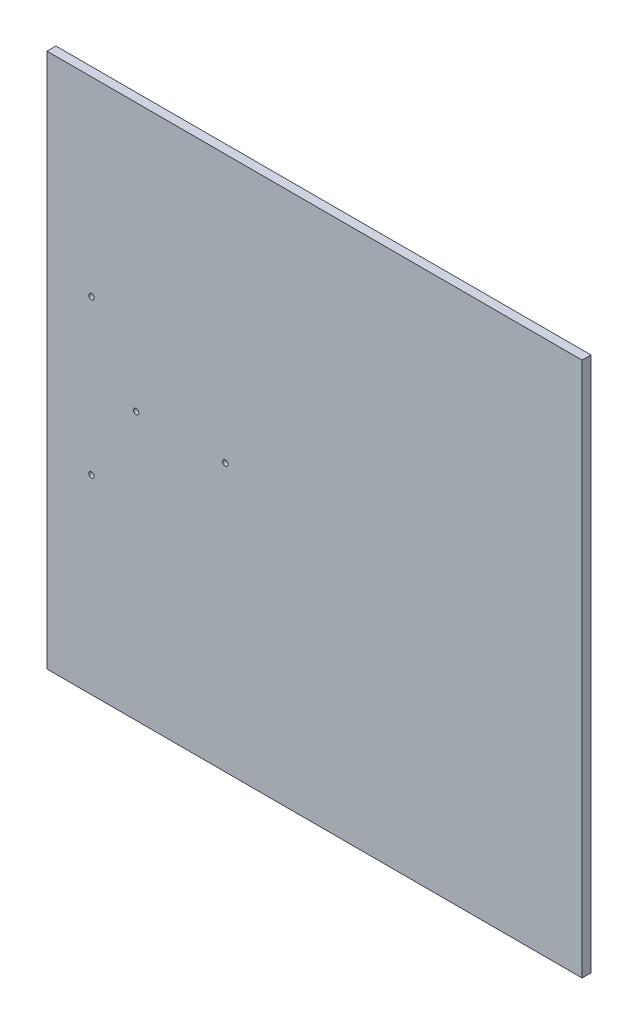
ISO-10303-21;
HEADER;
FILE_DESCRIPTION(('STEP AP214'),'2;1');
FILE_NAME('part.step','',(''),(''),'','','');
FILE_SCHEMA(('AUTOMOTIVE_DESIGN { 1 0 10303 214 1 1 1 1 }'));
ENDSEC;
DATA;
#1=APPLICATION_CONTEXT('core data for automotive mechanical design processes');
#2=APPLICATION_PROTOCOL_DEFINITION('international standard','automotive_design',2000,#1);
#3=PRODUCT_CONTEXT('',#1,'mechanical');
#4=PRODUCT('Part','Part','',(#3));
#5=PRODUCT_RELATED_PRODUCT_CATEGORY('part','',(#4));
#6=PRODUCT_DEFINITION_FORMATION('','',#4);
#7=PRODUCT_DEFINITION_CONTEXT('part definition',#1,'design');
#8=PRODUCT_DEFINITION('design','',#6,#7);
#9=PRODUCT_DEFINITION_SHAPE('','',#8);
#10=(LENGTH_UNIT() NAMED_UNIT(*) SI_UNIT(.MILLI.,.METRE.));
#11=(NAMED_UNIT(*) PLANE_ANGLE_UNIT() SI_UNIT($,.RADIAN.));
#12=(NAMED_UNIT(*) SI_UNIT($,.STERADIAN.) SOLID_ANGLE_UNIT());
#13=UNCERTAINTY_MEASURE_WITH_UNIT(LENGTH_MEASURE(1.E-05),#10,'distance_accuracy_value','');
#14=(GEOMETRIC_REPRESENTATION_CONTEXT(3) GLOBAL_UNCERTAINTY_ASSIGNED_CONTEXT((#13)) GLOBAL_UNIT_ASSIGNED_CONTEXT((#10,
#11,#12)) REPRESENTATION_CONTEXT('',''));
#15=CARTESIAN_POINT('',(0.,0.,0.));
#16=DIRECTION('',(0.,0.,1.));
#17=DIRECTION('',(1.,0.,0.));
#18=AXIS2_PLACEMENT_3D('',#15,#16,#17);
#19=CARTESIAN_POINT('',(-149.112426035503,66.5680473372781,5.));
#20=DIRECTION('',(1.,0.,0.));
#21=DIRECTION('',(0.,0.,-1.));
#22=AXIS2_PLACEMENT_3D('',#19,#20,#21);
#23=PLANE('',#22);
#24=DIRECTION('',(0.,-1.,0.));
#25=VECTOR('',#24,1.);
#26=CARTESIAN_POINT('',(-149.112426035503,66.5680473372781,0.));
#27=LINE('',#26,#25);
#28=CARTESIAN_POINT('',(-149.112426035503,66.5680473372781,0.));
#29=VERTEX_POINT('',#28);
#30=CARTESIAN_POINT('',(-149.112426035503,-233.431952662722,0.));
#31=VERTEX_POINT('',#30);
#32=EDGE_CURVE('E109',#29,#31,#27,.T.);
#33=ORIENTED_EDGE('',*,*,#32,.T.);
#34=DIRECTION('',(0.,0.,-1.));
#35=VECTOR('',#34,1.);
#36=CARTESIAN_POINT('',(-149.112426035503,-233.431952662722,5.));
#37=LINE('',#36,#35);
#38=CARTESIAN_POINT('',(-149.112426035503,-233.431952662722,5.));
#39=VERTEX_POINT('',#38);
#40=EDGE_CURVE('E11',#39,#31,#37,.T.);
#41=ORIENTED_EDGE('',*,*,#40,.F.);
#42=DIRECTION('',(0.,-1.,0.));
#43=VECTOR('',#42,1.);
#44=CARTESIAN_POINT('',(-149.112426035503,66.5680473372781,5.));
#45=LINE('',#44,#43);
#46=CARTESIAN_POINT('',(-149.112426035503,66.5680473372781,5.));
#47=VERTEX_POINT('',#46);
#48=EDGE_CURVE('E93',#47,#39,#45,.T.);
#49=ORIENTED_EDGE('',*,*,#48,.F.);
#50=DIRECTION('',(0.,0.,-1.));
#51=VECTOR('',#50,1.);
#52=CARTESIAN_POINT('',(-149.112426035503,66.5680473372781,5.));
#53=LINE('',#52,#51);
#54=EDGE_CURVE('E105',#47,#29,#53,.T.);
#55=ORIENTED_EDGE('',*,*,#54,.T.);
#56=EDGE_LOOP('',(#33,#41,#49,#55));
#57=FACE_BOUND('',#56,.T.);
#58=ADVANCED_FACE('F41',(#57),#23,.F.);
#59=CARTESIAN_POINT('',(-149.112426035503,-233.431952662722,5.));
#60=DIRECTION('',(0.,1.,0.));
#61=DIRECTION('',(0.,0.,1.));
#62=AXIS2_PLACEMENT_3D('',#59,#60,#61);
#63=PLANE('',#62);
#64=DIRECTION('',(1.,0.,0.));
#65=VECTOR('',#64,1.);
#66=CARTESIAN_POINT('',(-149.112426035503,-233.431952662722,0.));
#67=LINE('',#66,#65);
#68=CARTESIAN_POINT('',(150.887573964497,-233.431952662722,0.));
#69=VERTEX_POINT('',#68);
#70=EDGE_CURVE('E98',#31,#69,#67,.T.);
#71=ORIENTED_EDGE('',*,*,#70,.T.);
#72=DIRECTION('',(0.,0.,-1.));
#73=VECTOR('',#72,1.);
#74=CARTESIAN_POINT('',(150.887573964497,-233.431952662722,5.));
#75=LINE('',#74,#73);
#76=CARTESIAN_POINT('',(150.887573964497,-233.431952662722,5.));
#77=VERTEX_POINT('',#76);
#78=EDGE_CURVE('E50',#77,#69,#75,.T.);
#79=ORIENTED_EDGE('',*,*,#78,.F.);
#80=DIRECTION('',(1.,0.,0.));
#81=VECTOR('',#80,1.);
#82=CARTESIAN_POINT('',(-149.112426035503,-233.431952662722,5.));
#83=LINE('',#82,#81);
#84=EDGE_CURVE('E88',#39,#77,#83,.T.);
#85=ORIENTED_EDGE('',*,*,#84,.F.);
#86=ORIENTED_EDGE('',*,*,#40,.T.);
#87=EDGE_LOOP('',(#71,#79,#85,#86));
#88=FACE_BOUND('',#87,.T.);
#89=ADVANCED_FACE('F97',(#88),#63,.F.);
#90=CARTESIAN_POINT('',(150.887573964497,66.5680473372781,5.));
#91=DIRECTION('',(-1.,0.,0.));
#92=DIRECTION('',(0.,-1.,0.));
#93=AXIS2_PLACEMENT_3D('',#90,#91,#92);
#94=PLANE('',#93);
#95=DIRECTION('',(0.,1.,0.));
#96=VECTOR('',#95,1.);
#97=CARTESIAN_POINT('',(150.887573964497,66.5680473372781,0.));
#98=LINE('',#97,#96);
#99=CARTESIAN_POINT('',(150.887573964497,66.5680473372781,0.));
#100=VERTEX_POINT('',#99);
#101=EDGE_CURVE('E75',#69,#100,#98,.T.);
#102=ORIENTED_EDGE('',*,*,#101,.T.);
#103=DIRECTION('',(0.,0.,-1.));
#104=VECTOR('',#103,1.);
#105=CARTESIAN_POINT('',(150.887573964497,66.5680473372781,5.));
#106=LINE('',#105,#104);
#107=CARTESIAN_POINT('',(150.887573964497,66.5680473372781,5.));
#108=VERTEX_POINT('',#107);
#109=EDGE_CURVE('E100',#108,#100,#106,.T.);
#110=ORIENTED_EDGE('',*,*,#109,.F.);
#111=DIRECTION('',(0.,1.,0.));
#112=VECTOR('',#111,1.);
#113=CARTESIAN_POINT('',(150.887573964497,66.5680473372781,5.));
#114=LINE('',#113,#112);
#115=EDGE_CURVE('E91',#77,#108,#114,.T.);
#116=ORIENTED_EDGE('',*,*,#115,.F.);
#117=ORIENTED_EDGE('',*,*,#78,.T.);
#118=EDGE_LOOP('',(#102,#110,#116,#117));
#119=FACE_BOUND('',#118,.T.);
#120=ADVANCED_FACE('F101',(#119),#94,.F.);
#121=CARTESIAN_POINT('',(-149.112426035503,66.5680473372781,5.));
#122=DIRECTION('',(0.,-1.,0.));
#123=DIRECTION('',(0.,0.,-1.));
#124=AXIS2_PLACEMENT_3D('',#121,#122,#123);
#125=PLANE('',#124);
#126=DIRECTION('',(-1.,0.,0.));
#127=VECTOR('',#126,1.);
#128=CARTESIAN_POINT('',(-149.112426035503,66.5680473372781,0.));
#129=LINE('',#128,#127);
#130=EDGE_CURVE('E81',#100,#29,#129,.T.);
#131=ORIENTED_EDGE('',*,*,#130,.T.);
#132=ORIENTED_EDGE('',*,*,#54,.F.);
#133=DIRECTION('',(-1.,0.,0.));
#134=VECTOR('',#133,1.);
#135=CARTESIAN_POINT('',(-149.112426035503,66.5680473372781,5.));
#136=LINE('',#135,#134);
#137=EDGE_CURVE('E58',#108,#47,#136,.T.);
#138=ORIENTED_EDGE('',*,*,#137,.F.);
#139=ORIENTED_EDGE('',*,*,#109,.T.);
#140=EDGE_LOOP('',(#131,#132,#138,#139));
#141=FACE_BOUND('',#140,.T.);
#142=ADVANCED_FACE('F123',(#141),#125,.F.);
#143=CARTESIAN_POINT('',(0.,0.,5.));
#144=DIRECTION('',(0.,0.,1.));
#145=DIRECTION('',(1.,0.,0.));
#146=AXIS2_PLACEMENT_3D('',#143,#144,#145);
#147=PLANE('',#146);
#148=CARTESIAN_POINT('',(-49.112426035503,-83.4319526627219,5.));
#149=DIRECTION('',(0.,0.,1.));
#150=DIRECTION('',(1.,0.,0.));
#151=AXIS2_PLACEMENT_3D('',#148,#149,#150);
#152=CIRCLE('',#151,1.5);
#153=CARTESIAN_POINT('',(-47.612426035503,-83.4319526627219,5.));
#154=VERTEX_POINT('',#153);
#155=EDGE_CURVE('E154',#154,#154,#152,.T.);
#156=ORIENTED_EDGE('',*,*,#155,.F.);
#157=EDGE_LOOP('',(#156));
#158=FACE_BOUND('',#157,.T.);
#159=CARTESIAN_POINT('',(-124.112426035503,-40.1306824735001,5.));
#160=DIRECTION('',(0.,0.,1.));
#161=DIRECTION('',(1.,0.,0.));
#162=AXIS2_PLACEMENT_3D('',#159,#160,#161);
#163=CIRCLE('',#162,1.5);
#164=CARTESIAN_POINT('',(-122.612426035503,-40.1306824735001,5.));
#165=VERTEX_POINT('',#164);
#166=EDGE_CURVE('E146',#165,#165,#163,.T.);
#167=ORIENTED_EDGE('',*,*,#166,.F.);
#168=EDGE_LOOP('',(#167));
#169=FACE_BOUND('',#168,.T.);
#170=CARTESIAN_POINT('',(-124.112426035503,-126.733222851944,5.));
#171=DIRECTION('',(0.,0.,1.));
#172=DIRECTION('',(-1.,0.,0.));
#173=AXIS2_PLACEMENT_3D('',#170,#171,#172);
#174=CIRCLE('',#173,1.5);
#175=CARTESIAN_POINT('',(-125.612426035503,-126.733222851944,5.));
#176=VERTEX_POINT('',#175);
#177=EDGE_CURVE('E138',#176,#176,#174,.T.);
#178=ORIENTED_EDGE('',*,*,#177,.F.);
#179=EDGE_LOOP('',(#178));
#180=FACE_BOUND('',#179,.T.);
#181=CARTESIAN_POINT('',(-99.112426035503,-83.4319526627219,5.));
#182=DIRECTION('',(0.,0.,1.));
#183=DIRECTION('',(1.,0.,0.));
#184=AXIS2_PLACEMENT_3D('',#181,#182,#183);
#185=CIRCLE('',#184,1.5);
#186=CARTESIAN_POINT('',(-97.612426035503,-83.4319526627219,5.));
#187=VERTEX_POINT('',#186);
#188=EDGE_CURVE('E130',#187,#187,#185,.T.);
#189=ORIENTED_EDGE('',*,*,#188,.F.);
#190=EDGE_LOOP('',(#189));
#191=FACE_BOUND('',#190,.T.);
#192=ORIENTED_EDGE('',*,*,#48,.T.);
#193=ORIENTED_EDGE('',*,*,#84,.T.);
#194=ORIENTED_EDGE('',*,*,#115,.T.);
#195=ORIENTED_EDGE('',*,*,#137,.T.);
#196=EDGE_LOOP('',(#192,#193,#194,#195));
#197=FACE_BOUND('',#196,.T.);
#198=ADVANCED_FACE('F89',(#158,#169,#180,#191,#197),#147,.T.);
#199=CARTESIAN_POINT('',(0.,0.,0.));
#200=DIRECTION('',(0.,0.,1.));
#201=DIRECTION('',(1.,0.,0.));
#202=AXIS2_PLACEMENT_3D('',#199,#200,#201);
#203=PLANE('',#202);
#204=CARTESIAN_POINT('',(-49.112426035503,-83.4319526627219,0.));
#205=DIRECTION('',(0.,0.,1.));
#206=DIRECTION('',(1.,0.,0.));
#207=AXIS2_PLACEMENT_3D('',#204,#205,#206);
#208=CIRCLE('',#207,1.5);
#209=CARTESIAN_POINT('',(-47.612426035503,-83.4319526627219,0.));
#210=VERTEX_POINT('',#209);
#211=EDGE_CURVE('E134',#210,#210,#208,.T.);
#212=ORIENTED_EDGE('',*,*,#211,.T.);
#213=EDGE_LOOP('',(#212));
#214=FACE_BOUND('',#213,.T.);
#215=CARTESIAN_POINT('',(-124.112426035503,-40.1306824735001,0.));
#216=DIRECTION('',(0.,0.,1.));
#217=DIRECTION('',(1.,0.,0.));
#218=AXIS2_PLACEMENT_3D('',#215,#216,#217);
#219=CIRCLE('',#218,1.5);
#220=CARTESIAN_POINT('',(-122.612426035503,-40.1306824735001,0.));
#221=VERTEX_POINT('',#220);
#222=EDGE_CURVE('E150',#221,#221,#219,.T.);
#223=ORIENTED_EDGE('',*,*,#222,.T.);
#224=EDGE_LOOP('',(#223));
#225=FACE_BOUND('',#224,.T.);
#226=CARTESIAN_POINT('',(-124.112426035503,-126.733222851944,0.));
#227=DIRECTION('',(0.,0.,1.));
#228=DIRECTION('',(-1.,0.,0.));
#229=AXIS2_PLACEMENT_3D('',#226,#227,#228);
#230=CIRCLE('',#229,1.5);
#231=CARTESIAN_POINT('',(-125.612426035503,-126.733222851944,0.));
#232=VERTEX_POINT('',#231);
#233=EDGE_CURVE('E142',#232,#232,#230,.T.);
#234=ORIENTED_EDGE('',*,*,#233,.T.);
#235=EDGE_LOOP('',(#234));
#236=FACE_BOUND('',#235,.T.);
#237=CARTESIAN_POINT('',(-99.112426035503,-83.4319526627219,0.));
#238=DIRECTION('',(0.,0.,1.));
#239=DIRECTION('',(1.,0.,0.));
#240=AXIS2_PLACEMENT_3D('',#237,#238,#239);
#241=CIRCLE('',#240,1.5);
#242=CARTESIAN_POINT('',(-97.612426035503,-83.4319526627219,0.));
#243=VERTEX_POINT('',#242);
#244=EDGE_CURVE('E113',#243,#243,#241,.T.);
#245=ORIENTED_EDGE('',*,*,#244,.T.);
#246=EDGE_LOOP('',(#245));
#247=FACE_BOUND('',#246,.T.);
#248=ORIENTED_EDGE('',*,*,#32,.F.);
#249=ORIENTED_EDGE('',*,*,#130,.F.);
#250=ORIENTED_EDGE('',*,*,#101,.F.);
#251=ORIENTED_EDGE('',*,*,#70,.F.);
#252=EDGE_LOOP('',(#248,#249,#250,#251));
#253=FACE_BOUND('',#252,.T.);
#254=ADVANCED_FACE('F126',(#214,#225,#236,#247,#253),#203,.F.);
#255=CARTESIAN_POINT('',(-99.112426035503,-83.4319526627219,0.));
#256=DIRECTION('',(0.,0.,1.));
#257=DIRECTION('',(1.,0.,0.));
#258=AXIS2_PLACEMENT_3D('',#255,#256,#257);
#259=CYLINDRICAL_SURFACE('',#258,1.5);
#260=ORIENTED_EDGE('',*,*,#244,.F.);
#261=EDGE_LOOP('',(#260));
#262=FACE_BOUND('',#261,.T.);
#263=ORIENTED_EDGE('',*,*,#188,.T.);
#264=EDGE_LOOP('',(#263));
#265=FACE_BOUND('',#264,.T.);
#266=ADVANCED_FACE('F180',(#262,#265),#259,.F.);
#267=CARTESIAN_POINT('',(-124.112426035503,-126.733222851944,0.));
#268=DIRECTION('',(0.,0.,1.));
#269=DIRECTION('',(1.,0.,0.));
#270=AXIS2_PLACEMENT_3D('',#267,#268,#269);
#271=CYLINDRICAL_SURFACE('',#270,1.5);
#272=ORIENTED_EDGE('',*,*,#233,.F.);
#273=EDGE_LOOP('',(#272));
#274=FACE_BOUND('',#273,.T.);
#275=ORIENTED_EDGE('',*,*,#177,.T.);
#276=EDGE_LOOP('',(#275));
#277=FACE_BOUND('',#276,.T.);
#278=ADVANCED_FACE('F182',(#274,#277),#271,.F.);
#279=CARTESIAN_POINT('',(-124.112426035503,-40.1306824735001,0.));
#280=DIRECTION('',(0.,0.,1.));
#281=DIRECTION('',(1.,0.,0.));
#282=AXIS2_PLACEMENT_3D('',#279,#280,#281);
#283=CYLINDRICAL_SURFACE('',#282,1.5);
#284=ORIENTED_EDGE('',*,*,#222,.F.);
#285=EDGE_LOOP('',(#284));
#286=FACE_BOUND('',#285,.T.);
#287=ORIENTED_EDGE('',*,*,#166,.T.);
#288=EDGE_LOOP('',(#287));
#289=FACE_BOUND('',#288,.T.);
#290=ADVANCED_FACE('F167',(#286,#289),#283,.F.);
#291=CARTESIAN_POINT('',(-49.112426035503,-83.4319526627219,0.));
#292=DIRECTION('',(0.,0.,1.));
#293=DIRECTION('',(1.,0.,0.));
#294=AXIS2_PLACEMENT_3D('',#291,#292,#293);
#295=CYLINDRICAL_SURFACE('',#294,1.5);
#296=ORIENTED_EDGE('',*,*,#211,.F.);
#297=EDGE_LOOP('',(#296));
#298=FACE_BOUND('',#297,.T.);
#299=ORIENTED_EDGE('',*,*,#155,.T.);
#300=EDGE_LOOP('',(#299));
#301=FACE_BOUND('',#300,.T.);
#302=ADVANCED_FACE('F164',(#298,#301),#295,.F.);
#303=CLOSED_SHELL('',(#58,#89,#120,#142,#198,#254,#266,#278,#290,#302));
#304=MANIFOLD_SOLID_BREP('B2',#303);
#305=ADVANCED_BREP_SHAPE_REPRESENTATION('',(#18,#304),#14);
#306=SHAPE_DEFINITION_REPRESENTATION(#9,#305);
ENDSEC;
END-ISO-10303-21;
